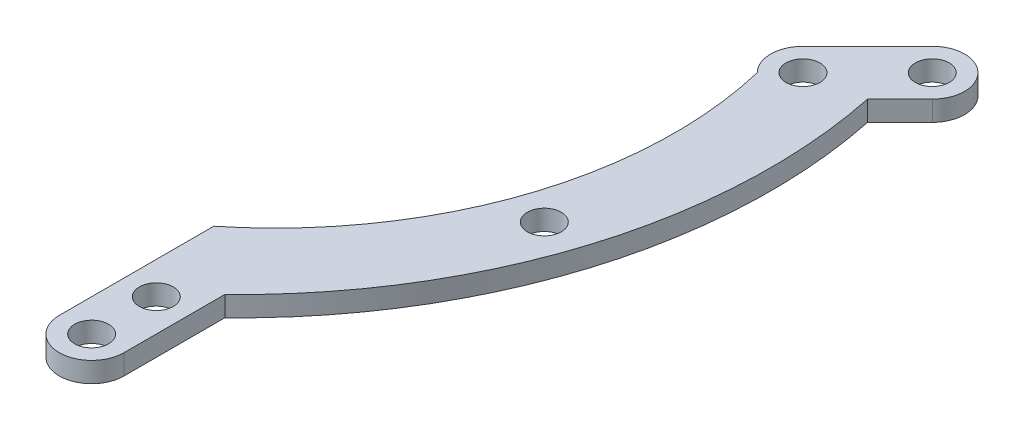
ISO-10303-21;
HEADER;
FILE_DESCRIPTION(('STEP AP214'),'2;1');
FILE_NAME('part.step','',(''),(''),'','','');
FILE_SCHEMA(('AUTOMOTIVE_DESIGN { 1 0 10303 214 1 1 1 1 }'));
ENDSEC;
DATA;
#1=APPLICATION_CONTEXT('core data for automotive mechanical design processes');
#2=APPLICATION_PROTOCOL_DEFINITION('international standard','automotive_design',2000,#1);
#3=PRODUCT_CONTEXT('',#1,'mechanical');
#4=PRODUCT('Part','Part','',(#3));
#5=PRODUCT_RELATED_PRODUCT_CATEGORY('part','',(#4));
#6=PRODUCT_DEFINITION_FORMATION('','',#4);
#7=PRODUCT_DEFINITION_CONTEXT('part definition',#1,'design');
#8=PRODUCT_DEFINITION('design','',#6,#7);
#9=PRODUCT_DEFINITION_SHAPE('','',#8);
#10=(LENGTH_UNIT() NAMED_UNIT(*) SI_UNIT(.MILLI.,.METRE.));
#11=(NAMED_UNIT(*) PLANE_ANGLE_UNIT() SI_UNIT($,.RADIAN.));
#12=(NAMED_UNIT(*) SI_UNIT($,.STERADIAN.) SOLID_ANGLE_UNIT());
#13=UNCERTAINTY_MEASURE_WITH_UNIT(LENGTH_MEASURE(1.E-05),#10,'distance_accuracy_value','');
#14=(GEOMETRIC_REPRESENTATION_CONTEXT(3) GLOBAL_UNCERTAINTY_ASSIGNED_CONTEXT((#13)) GLOBAL_UNIT_ASSIGNED_CONTEXT((#10,
#11,#12)) REPRESENTATION_CONTEXT('',''));
#15=CARTESIAN_POINT('',(0.,0.,0.));
#16=DIRECTION('',(0.,0.,1.));
#17=DIRECTION('',(1.,0.,0.));
#18=AXIS2_PLACEMENT_3D('',#15,#16,#17);
#19=CARTESIAN_POINT('',(-34.9552637204431,2.5,-17.7000790989439));
#20=DIRECTION('',(0.,1.,0.));
#21=DIRECTION('',(0.,0.,1.));
#22=AXIS2_PLACEMENT_3D('',#19,#20,#21);
#23=PLANE('',#22);
#24=CARTESIAN_POINT('',(16.,2.5,-32.));
#25=DIRECTION('',(0.,1.,0.));
#26=DIRECTION('',(0.,0.,1.));
#27=AXIS2_PLACEMENT_3D('',#24,#25,#26);
#28=CIRCLE('',#27,2.1);
#29=CARTESIAN_POINT('',(16.,2.5,-29.9));
#30=VERTEX_POINT('',#29);
#31=EDGE_CURVE('E210',#30,#30,#28,.T.);
#32=ORIENTED_EDGE('',*,*,#31,.F.);
#33=EDGE_LOOP('',(#32));
#34=FACE_BOUND('',#33,.T.);
#35=CARTESIAN_POINT('',(0.,2.5,32.));
#36=DIRECTION('',(0.,1.,0.));
#37=DIRECTION('',(0.,0.,1.));
#38=AXIS2_PLACEMENT_3D('',#35,#36,#37);
#39=CIRCLE('',#38,2.1);
#40=CARTESIAN_POINT('',(0.,2.5,34.1));
#41=VERTEX_POINT('',#40);
#42=EDGE_CURVE('E198',#41,#41,#39,.T.);
#43=ORIENTED_EDGE('',*,*,#42,.F.);
#44=EDGE_LOOP('',(#43));
#45=FACE_BOUND('',#44,.T.);
#46=CARTESIAN_POINT('',(-34.9552637204431,2.5,-17.7000790989439));
#47=DIRECTION('',(0.,-1.,0.));
#48=DIRECTION('',(0.,0.,1.));
#49=AXIS2_PLACEMENT_3D('',#46,#47,#48);
#50=CIRCLE('',#49,49.4751207190931);
#51=CARTESIAN_POINT('',(13.1715728752538,2.5,-29.1715728752538));
#52=VERTEX_POINT('',#51);
#53=CARTESIAN_POINT('',(-4.,2.5,20.8947290773723));
#54=VERTEX_POINT('',#53);
#55=EDGE_CURVE('E154',#52,#54,#50,.T.);
#56=ORIENTED_EDGE('',*,*,#55,.T.);
#57=DIRECTION('',(0.,0.,1.));
#58=VECTOR('',#57,1.);
#59=CARTESIAN_POINT('',(-4.,2.5,20.8947290773723));
#60=LINE('',#59,#58);
#61=CARTESIAN_POINT('',(-4.,2.5,40.));
#62=VERTEX_POINT('',#61);
#63=EDGE_CURVE('E96',#54,#62,#60,.T.);
#64=ORIENTED_EDGE('',*,*,#63,.T.);
#65=CARTESIAN_POINT('',(0.,2.5,40.));
#66=DIRECTION('',(0.,1.,0.));
#67=DIRECTION('',(0.,0.,1.));
#68=AXIS2_PLACEMENT_3D('',#65,#66,#67);
#69=CIRCLE('',#68,4.);
#70=CARTESIAN_POINT('',(4.,2.5,40.));
#71=VERTEX_POINT('',#70);
#72=EDGE_CURVE('E172',#62,#71,#69,.T.);
#73=ORIENTED_EDGE('',*,*,#72,.T.);
#74=DIRECTION('',(0.,0.,-1.));
#75=VECTOR('',#74,1.);
#76=CARTESIAN_POINT('',(4.,2.5,36.));
#77=LINE('',#76,#75);
#78=CARTESIAN_POINT('',(4.,2.5,27.5250815722734));
#79=VERTEX_POINT('',#78);
#80=EDGE_CURVE('E188',#71,#79,#77,.T.);
#81=ORIENTED_EDGE('',*,*,#80,.T.);
#82=CARTESIAN_POINT('',(-41.5780607116321,2.5,-19.8821435103053));
#83=DIRECTION('',(0.,1.,0.));
#84=DIRECTION('',(0.,0.,1.));
#85=AXIS2_PLACEMENT_3D('',#82,#83,#84);
#86=CIRCLE('',#85,65.7632466371871);
#87=CARTESIAN_POINT('',(22.8284271247462,2.5,-33.1715728752538));
#88=VERTEX_POINT('',#87);
#89=EDGE_CURVE('E187',#79,#88,#86,.T.);
#90=ORIENTED_EDGE('',*,*,#89,.T.);
#91=DIRECTION('',(0.707106781186547,0.,-0.707106781186548));
#92=VECTOR('',#91,1.);
#93=CARTESIAN_POINT('',(22.8284271247462,2.5,-33.1715728752538));
#94=LINE('',#93,#92);
#95=CARTESIAN_POINT('',(26.8284271247462,2.5,-37.1715728752538));
#96=VERTEX_POINT('',#95);
#97=EDGE_CURVE('E118',#88,#96,#94,.T.);
#98=ORIENTED_EDGE('',*,*,#97,.T.);
#99=CARTESIAN_POINT('',(24.,2.5,-40.));
#100=DIRECTION('',(0.,1.,0.));
#101=DIRECTION('',(0.,0.,1.));
#102=AXIS2_PLACEMENT_3D('',#99,#100,#101);
#103=CIRCLE('',#102,4.);
#104=CARTESIAN_POINT('',(21.1715728752538,2.5,-42.8284271247462));
#105=VERTEX_POINT('',#104);
#106=EDGE_CURVE('E112',#96,#105,#103,.T.);
#107=ORIENTED_EDGE('',*,*,#106,.T.);
#108=DIRECTION('',(-0.707106781186547,0.,0.707106781186548));
#109=VECTOR('',#108,1.);
#110=CARTESIAN_POINT('',(13.1715728752538,2.5,-34.8284271247462));
#111=LINE('',#110,#109);
#112=CARTESIAN_POINT('',(13.1715728752538,2.5,-34.8284271247462));
#113=VERTEX_POINT('',#112);
#114=EDGE_CURVE('E116',#105,#113,#111,.T.);
#115=ORIENTED_EDGE('',*,*,#114,.T.);
#116=CARTESIAN_POINT('',(16.,2.5,-32.));
#117=DIRECTION('',(0.,1.,0.));
#118=DIRECTION('',(0.,0.,1.));
#119=AXIS2_PLACEMENT_3D('',#116,#117,#118);
#120=CIRCLE('',#119,4.);
#121=EDGE_CURVE('E50',#113,#52,#120,.T.);
#122=ORIENTED_EDGE('',*,*,#121,.T.);
#123=EDGE_LOOP('',(#56,#64,#73,#81,#90,#98,#107,#115,#122));
#124=FACE_BOUND('',#123,.T.);
#125=CARTESIAN_POINT('',(16.,2.5,0.));
#126=DIRECTION('',(0.,1.,0.));
#127=DIRECTION('',(0.,0.,1.));
#128=AXIS2_PLACEMENT_3D('',#125,#126,#127);
#129=CIRCLE('',#128,2.1);
#130=CARTESIAN_POINT('',(16.,2.5,2.1));
#131=VERTEX_POINT('',#130);
#132=EDGE_CURVE('E140',#131,#131,#129,.T.);
#133=ORIENTED_EDGE('',*,*,#132,.F.);
#134=EDGE_LOOP('',(#133));
#135=FACE_BOUND('',#134,.T.);
#136=CARTESIAN_POINT('',(0.,2.5,40.));
#137=DIRECTION('',(0.,1.,0.));
#138=DIRECTION('',(0.,0.,1.));
#139=AXIS2_PLACEMENT_3D('',#136,#137,#138);
#140=CIRCLE('',#139,2.1);
#141=CARTESIAN_POINT('',(0.,2.5,42.1));
#142=VERTEX_POINT('',#141);
#143=EDGE_CURVE('E204',#142,#142,#140,.T.);
#144=ORIENTED_EDGE('',*,*,#143,.F.);
#145=EDGE_LOOP('',(#144));
#146=FACE_BOUND('',#145,.T.);
#147=CARTESIAN_POINT('',(24.,2.5,-40.));
#148=DIRECTION('',(0.,1.,0.));
#149=DIRECTION('',(0.,0.,1.));
#150=AXIS2_PLACEMENT_3D('',#147,#148,#149);
#151=CIRCLE('',#150,2.1);
#152=CARTESIAN_POINT('',(24.,2.5,-37.9));
#153=VERTEX_POINT('',#152);
#154=EDGE_CURVE('E216',#153,#153,#151,.T.);
#155=ORIENTED_EDGE('',*,*,#154,.F.);
#156=EDGE_LOOP('',(#155));
#157=FACE_BOUND('',#156,.T.);
#158=ADVANCED_FACE('F33',(#34,#45,#124,#135,#146,#157),#23,.T.);
#159=CARTESIAN_POINT('',(-34.9552637204431,0.,-17.7000790989439));
#160=DIRECTION('',(0.,1.,0.));
#161=DIRECTION('',(0.,0.,1.));
#162=AXIS2_PLACEMENT_3D('',#159,#160,#161);
#163=PLANE('',#162);
#164=CARTESIAN_POINT('',(-34.9552637204431,0.,-17.7000790989439));
#165=DIRECTION('',(0.,-1.,0.));
#166=DIRECTION('',(0.,0.,1.));
#167=AXIS2_PLACEMENT_3D('',#164,#165,#166);
#168=CIRCLE('',#167,49.4751207190931);
#169=CARTESIAN_POINT('',(13.1715728752538,0.,-29.1715728752538));
#170=VERTEX_POINT('',#169);
#171=CARTESIAN_POINT('',(-4.,0.,20.8947290773723));
#172=VERTEX_POINT('',#171);
#173=EDGE_CURVE('E136',#170,#172,#168,.T.);
#174=ORIENTED_EDGE('',*,*,#173,.F.);
#175=CARTESIAN_POINT('',(16.,0.,-32.));
#176=DIRECTION('',(0.,1.,0.));
#177=DIRECTION('',(0.,0.,1.));
#178=AXIS2_PLACEMENT_3D('',#175,#176,#177);
#179=CIRCLE('',#178,4.);
#180=CARTESIAN_POINT('',(13.1715728752538,0.,-34.8284271247462));
#181=VERTEX_POINT('',#180);
#182=EDGE_CURVE('E88',#181,#170,#179,.T.);
#183=ORIENTED_EDGE('',*,*,#182,.F.);
#184=DIRECTION('',(-0.707106781186547,0.,0.707106781186548));
#185=VECTOR('',#184,1.);
#186=CARTESIAN_POINT('',(13.1715728752538,0.,-34.8284271247462));
#187=LINE('',#186,#185);
#188=CARTESIAN_POINT('',(21.1715728752538,0.,-42.8284271247462));
#189=VERTEX_POINT('',#188);
#190=EDGE_CURVE('E82',#189,#181,#187,.T.);
#191=ORIENTED_EDGE('',*,*,#190,.F.);
#192=CARTESIAN_POINT('',(24.,0.,-40.));
#193=DIRECTION('',(0.,1.,0.));
#194=DIRECTION('',(0.,0.,1.));
#195=AXIS2_PLACEMENT_3D('',#192,#193,#194);
#196=CIRCLE('',#195,4.);
#197=CARTESIAN_POINT('',(26.8284271247462,0.,-37.1715728752538));
#198=VERTEX_POINT('',#197);
#199=EDGE_CURVE('E126',#198,#189,#196,.T.);
#200=ORIENTED_EDGE('',*,*,#199,.F.);
#201=DIRECTION('',(0.707106781186547,0.,-0.707106781186548));
#202=VECTOR('',#201,1.);
#203=CARTESIAN_POINT('',(22.8284271247462,0.,-33.1715728752538));
#204=LINE('',#203,#202);
#205=CARTESIAN_POINT('',(22.8284271247462,0.,-33.1715728752538));
#206=VERTEX_POINT('',#205);
#207=EDGE_CURVE('E149',#206,#198,#204,.T.);
#208=ORIENTED_EDGE('',*,*,#207,.F.);
#209=CARTESIAN_POINT('',(-41.5780607116321,0.,-19.8821435103053));
#210=DIRECTION('',(0.,1.,0.));
#211=DIRECTION('',(0.,0.,1.));
#212=AXIS2_PLACEMENT_3D('',#209,#210,#211);
#213=CIRCLE('',#212,65.7632466371871);
#214=CARTESIAN_POINT('',(4.,0.,27.5250815722734));
#215=VERTEX_POINT('',#214);
#216=EDGE_CURVE('E147',#215,#206,#213,.T.);
#217=ORIENTED_EDGE('',*,*,#216,.F.);
#218=DIRECTION('',(0.,0.,-1.));
#219=VECTOR('',#218,1.);
#220=CARTESIAN_POINT('',(4.,0.,27.5250815722734));
#221=LINE('',#220,#219);
#222=CARTESIAN_POINT('',(4.,0.,40.));
#223=VERTEX_POINT('',#222);
#224=EDGE_CURVE('E145',#223,#215,#221,.T.);
#225=ORIENTED_EDGE('',*,*,#224,.F.);
#226=CARTESIAN_POINT('',(0.,0.,40.));
#227=DIRECTION('',(0.,1.,0.));
#228=DIRECTION('',(0.,0.,1.));
#229=AXIS2_PLACEMENT_3D('',#226,#227,#228);
#230=CIRCLE('',#229,4.);
#231=CARTESIAN_POINT('',(-4.,0.,40.));
#232=VERTEX_POINT('',#231);
#233=EDGE_CURVE('E142',#232,#223,#230,.T.);
#234=ORIENTED_EDGE('',*,*,#233,.F.);
#235=DIRECTION('',(0.,0.,1.));
#236=VECTOR('',#235,1.);
#237=CARTESIAN_POINT('',(-4.,0.,32.));
#238=LINE('',#237,#236);
#239=EDGE_CURVE('E139',#172,#232,#238,.T.);
#240=ORIENTED_EDGE('',*,*,#239,.F.);
#241=EDGE_LOOP('',(#174,#183,#191,#200,#208,#217,#225,#234,#240));
#242=FACE_BOUND('',#241,.T.);
#243=CARTESIAN_POINT('',(16.,0.,0.));
#244=DIRECTION('',(0.,1.,0.));
#245=DIRECTION('',(0.,0.,1.));
#246=AXIS2_PLACEMENT_3D('',#243,#244,#245);
#247=CIRCLE('',#246,2.1);
#248=CARTESIAN_POINT('',(16.,0.,2.1));
#249=VERTEX_POINT('',#248);
#250=EDGE_CURVE('E195',#249,#249,#247,.T.);
#251=ORIENTED_EDGE('',*,*,#250,.T.);
#252=EDGE_LOOP('',(#251));
#253=FACE_BOUND('',#252,.T.);
#254=CARTESIAN_POINT('',(0.,0.,32.));
#255=DIRECTION('',(0.,1.,0.));
#256=DIRECTION('',(0.,0.,1.));
#257=AXIS2_PLACEMENT_3D('',#254,#255,#256);
#258=CIRCLE('',#257,2.1);
#259=CARTESIAN_POINT('',(0.,0.,34.1));
#260=VERTEX_POINT('',#259);
#261=EDGE_CURVE('E201',#260,#260,#258,.T.);
#262=ORIENTED_EDGE('',*,*,#261,.T.);
#263=EDGE_LOOP('',(#262));
#264=FACE_BOUND('',#263,.T.);
#265=CARTESIAN_POINT('',(0.,0.,40.));
#266=DIRECTION('',(0.,1.,0.));
#267=DIRECTION('',(0.,0.,1.));
#268=AXIS2_PLACEMENT_3D('',#265,#266,#267);
#269=CIRCLE('',#268,2.1);
#270=CARTESIAN_POINT('',(0.,0.,42.1));
#271=VERTEX_POINT('',#270);
#272=EDGE_CURVE('E207',#271,#271,#269,.T.);
#273=ORIENTED_EDGE('',*,*,#272,.T.);
#274=EDGE_LOOP('',(#273));
#275=FACE_BOUND('',#274,.T.);
#276=CARTESIAN_POINT('',(16.,0.,-32.));
#277=DIRECTION('',(0.,1.,0.));
#278=DIRECTION('',(0.,0.,1.));
#279=AXIS2_PLACEMENT_3D('',#276,#277,#278);
#280=CIRCLE('',#279,2.1);
#281=CARTESIAN_POINT('',(16.,0.,-29.9));
#282=VERTEX_POINT('',#281);
#283=EDGE_CURVE('E213',#282,#282,#280,.T.);
#284=ORIENTED_EDGE('',*,*,#283,.T.);
#285=EDGE_LOOP('',(#284));
#286=FACE_BOUND('',#285,.T.);
#287=CARTESIAN_POINT('',(24.,0.,-40.));
#288=DIRECTION('',(0.,1.,0.));
#289=DIRECTION('',(0.,0.,1.));
#290=AXIS2_PLACEMENT_3D('',#287,#288,#289);
#291=CIRCLE('',#290,2.1);
#292=CARTESIAN_POINT('',(24.,0.,-37.9));
#293=VERTEX_POINT('',#292);
#294=EDGE_CURVE('E219',#293,#293,#291,.T.);
#295=ORIENTED_EDGE('',*,*,#294,.T.);
#296=EDGE_LOOP('',(#295));
#297=FACE_BOUND('',#296,.T.);
#298=ADVANCED_FACE('F175',(#242,#253,#264,#275,#286,#297),#163,.F.);
#299=CARTESIAN_POINT('',(-34.9552637204431,2.5,-17.7000790989439));
#300=DIRECTION('',(0.,-1.,0.));
#301=DIRECTION('',(0.,0.,-1.));
#302=AXIS2_PLACEMENT_3D('',#299,#300,#301);
#303=CYLINDRICAL_SURFACE('',#302,49.4751207190931);
#304=ORIENTED_EDGE('',*,*,#173,.T.);
#305=DIRECTION('',(0.,-1.,0.));
#306=VECTOR('',#305,1.);
#307=CARTESIAN_POINT('',(-4.,2.5,20.8947290773723));
#308=LINE('',#307,#306);
#309=EDGE_CURVE('E11',#54,#172,#308,.T.);
#310=ORIENTED_EDGE('',*,*,#309,.F.);
#311=ORIENTED_EDGE('',*,*,#55,.F.);
#312=DIRECTION('',(0.,-1.,0.));
#313=VECTOR('',#312,1.);
#314=CARTESIAN_POINT('',(13.1715728752538,2.5,-29.1715728752538));
#315=LINE('',#314,#313);
#316=EDGE_CURVE('E132',#52,#170,#315,.T.);
#317=ORIENTED_EDGE('',*,*,#316,.T.);
#318=EDGE_LOOP('',(#304,#310,#311,#317));
#319=FACE_BOUND('',#318,.T.);
#320=ADVANCED_FACE('F35',(#319),#303,.F.);
#321=CARTESIAN_POINT('',(-4.,2.5,32.));
#322=DIRECTION('',(1.,0.,0.));
#323=DIRECTION('',(0.,0.,-1.));
#324=AXIS2_PLACEMENT_3D('',#321,#322,#323);
#325=PLANE('',#324);
#326=ORIENTED_EDGE('',*,*,#239,.T.);
#327=DIRECTION('',(0.,-1.,0.));
#328=VECTOR('',#327,1.);
#329=CARTESIAN_POINT('',(-4.,2.5,40.));
#330=LINE('',#329,#328);
#331=EDGE_CURVE('E42',#62,#232,#330,.T.);
#332=ORIENTED_EDGE('',*,*,#331,.F.);
#333=ORIENTED_EDGE('',*,*,#63,.F.);
#334=ORIENTED_EDGE('',*,*,#309,.T.);
#335=EDGE_LOOP('',(#326,#332,#333,#334));
#336=FACE_BOUND('',#335,.T.);
#337=ADVANCED_FACE('F257',(#336),#325,.F.);
#338=CARTESIAN_POINT('',(0.,2.5,40.));
#339=DIRECTION('',(0.,-1.,0.));
#340=DIRECTION('',(0.,0.,-1.));
#341=AXIS2_PLACEMENT_3D('',#338,#339,#340);
#342=CYLINDRICAL_SURFACE('',#341,4.);
#343=ORIENTED_EDGE('',*,*,#233,.T.);
#344=DIRECTION('',(0.,-1.,0.));
#345=VECTOR('',#344,1.);
#346=CARTESIAN_POINT('',(4.,2.5,40.));
#347=LINE('',#346,#345);
#348=EDGE_CURVE('E164',#71,#223,#347,.T.);
#349=ORIENTED_EDGE('',*,*,#348,.F.);
#350=ORIENTED_EDGE('',*,*,#72,.F.);
#351=ORIENTED_EDGE('',*,*,#331,.T.);
#352=EDGE_LOOP('',(#343,#349,#350,#351));
#353=FACE_BOUND('',#352,.T.);
#354=ADVANCED_FACE('F170',(#353),#342,.T.);
#355=CARTESIAN_POINT('',(4.,2.5,27.5250815722734));
#356=DIRECTION('',(-1.,0.,0.));
#357=DIRECTION('',(0.,0.,1.));
#358=AXIS2_PLACEMENT_3D('',#355,#356,#357);
#359=PLANE('',#358);
#360=ORIENTED_EDGE('',*,*,#224,.T.);
#361=DIRECTION('',(0.,-1.,0.));
#362=VECTOR('',#361,1.);
#363=CARTESIAN_POINT('',(4.,2.5,27.5250815722734));
#364=LINE('',#363,#362);
#365=EDGE_CURVE('E161',#79,#215,#364,.T.);
#366=ORIENTED_EDGE('',*,*,#365,.F.);
#367=ORIENTED_EDGE('',*,*,#80,.F.);
#368=ORIENTED_EDGE('',*,*,#348,.T.);
#369=EDGE_LOOP('',(#360,#366,#367,#368));
#370=FACE_BOUND('',#369,.T.);
#371=ADVANCED_FACE('F181',(#370),#359,.F.);
#372=CARTESIAN_POINT('',(-41.5780607116321,2.5,-19.8821435103053));
#373=DIRECTION('',(0.,-1.,0.));
#374=DIRECTION('',(0.,0.,-1.));
#375=AXIS2_PLACEMENT_3D('',#372,#373,#374);
#376=CYLINDRICAL_SURFACE('',#375,65.7632466371871);
#377=ORIENTED_EDGE('',*,*,#216,.T.);
#378=DIRECTION('',(0.,-1.,0.));
#379=VECTOR('',#378,1.);
#380=CARTESIAN_POINT('',(22.8284271247462,2.5,-33.1715728752538));
#381=LINE('',#380,#379);
#382=EDGE_CURVE('E158',#88,#206,#381,.T.);
#383=ORIENTED_EDGE('',*,*,#382,.F.);
#384=ORIENTED_EDGE('',*,*,#89,.F.);
#385=ORIENTED_EDGE('',*,*,#365,.T.);
#386=EDGE_LOOP('',(#377,#383,#384,#385));
#387=FACE_BOUND('',#386,.T.);
#388=ADVANCED_FACE('F185',(#387),#376,.T.);
#389=CARTESIAN_POINT('',(22.8284271247462,2.5,-33.1715728752538));
#390=DIRECTION('',(-0.707106781186548,0.,-0.707106781186547));
#391=DIRECTION('',(-0.707106781186547,0.,0.707106781186548));
#392=AXIS2_PLACEMENT_3D('',#389,#390,#391);
#393=PLANE('',#392);
#394=ORIENTED_EDGE('',*,*,#207,.T.);
#395=DIRECTION('',(0.,-1.,0.));
#396=VECTOR('',#395,1.);
#397=CARTESIAN_POINT('',(26.8284271247462,2.5,-37.1715728752538));
#398=LINE('',#397,#396);
#399=EDGE_CURVE('E127',#96,#198,#398,.T.);
#400=ORIENTED_EDGE('',*,*,#399,.F.);
#401=ORIENTED_EDGE('',*,*,#97,.F.);
#402=ORIENTED_EDGE('',*,*,#382,.T.);
#403=EDGE_LOOP('',(#394,#400,#401,#402));
#404=FACE_BOUND('',#403,.T.);
#405=ADVANCED_FACE('F248',(#404),#393,.F.);
#406=CARTESIAN_POINT('',(24.,2.5,-40.));
#407=DIRECTION('',(0.,-1.,0.));
#408=DIRECTION('',(0.,0.,-1.));
#409=AXIS2_PLACEMENT_3D('',#406,#407,#408);
#410=CYLINDRICAL_SURFACE('',#409,4.);
#411=ORIENTED_EDGE('',*,*,#199,.T.);
#412=DIRECTION('',(0.,-1.,0.));
#413=VECTOR('',#412,1.);
#414=CARTESIAN_POINT('',(21.1715728752538,2.5,-42.8284271247462));
#415=LINE('',#414,#413);
#416=EDGE_CURVE('E123',#105,#189,#415,.T.);
#417=ORIENTED_EDGE('',*,*,#416,.F.);
#418=ORIENTED_EDGE('',*,*,#106,.F.);
#419=ORIENTED_EDGE('',*,*,#399,.T.);
#420=EDGE_LOOP('',(#411,#417,#418,#419));
#421=FACE_BOUND('',#420,.T.);
#422=ADVANCED_FACE('F124',(#421),#410,.T.);
#423=CARTESIAN_POINT('',(13.1715728752538,2.5,-34.8284271247462));
#424=DIRECTION('',(0.707106781186548,0.,0.707106781186547));
#425=DIRECTION('',(0.707106781186547,0.,-0.707106781186548));
#426=AXIS2_PLACEMENT_3D('',#423,#424,#425);
#427=PLANE('',#426);
#428=ORIENTED_EDGE('',*,*,#190,.T.);
#429=DIRECTION('',(0.,-1.,0.));
#430=VECTOR('',#429,1.);
#431=CARTESIAN_POINT('',(13.1715728752538,2.5,-34.8284271247462));
#432=LINE('',#431,#430);
#433=EDGE_CURVE('E128',#113,#181,#432,.T.);
#434=ORIENTED_EDGE('',*,*,#433,.F.);
#435=ORIENTED_EDGE('',*,*,#114,.F.);
#436=ORIENTED_EDGE('',*,*,#416,.T.);
#437=EDGE_LOOP('',(#428,#434,#435,#436));
#438=FACE_BOUND('',#437,.T.);
#439=ADVANCED_FACE('F130',(#438),#427,.F.);
#440=CARTESIAN_POINT('',(16.,2.5,-32.));
#441=DIRECTION('',(0.,-1.,0.));
#442=DIRECTION('',(0.,0.,-1.));
#443=AXIS2_PLACEMENT_3D('',#440,#441,#442);
#444=CYLINDRICAL_SURFACE('',#443,4.);
#445=ORIENTED_EDGE('',*,*,#182,.T.);
#446=ORIENTED_EDGE('',*,*,#316,.F.);
#447=ORIENTED_EDGE('',*,*,#121,.F.);
#448=ORIENTED_EDGE('',*,*,#433,.T.);
#449=EDGE_LOOP('',(#445,#446,#447,#448));
#450=FACE_BOUND('',#449,.T.);
#451=ADVANCED_FACE('F241',(#450),#444,.T.);
#452=CARTESIAN_POINT('',(16.,2.5,0.));
#453=DIRECTION('',(0.,-1.,0.));
#454=DIRECTION('',(0.,0.,-1.));
#455=AXIS2_PLACEMENT_3D('',#452,#453,#454);
#456=CYLINDRICAL_SURFACE('',#455,2.1);
#457=ORIENTED_EDGE('',*,*,#132,.T.);
#458=EDGE_LOOP('',(#457));
#459=FACE_BOUND('',#458,.T.);
#460=ORIENTED_EDGE('',*,*,#250,.F.);
#461=EDGE_LOOP('',(#460));
#462=FACE_BOUND('',#461,.T.);
#463=ADVANCED_FACE('F238',(#459,#462),#456,.F.);
#464=CARTESIAN_POINT('',(0.,2.5,32.));
#465=DIRECTION('',(0.,-1.,0.));
#466=DIRECTION('',(0.,0.,-1.));
#467=AXIS2_PLACEMENT_3D('',#464,#465,#466);
#468=CYLINDRICAL_SURFACE('',#467,2.1);
#469=ORIENTED_EDGE('',*,*,#42,.T.);
#470=EDGE_LOOP('',(#469));
#471=FACE_BOUND('',#470,.T.);
#472=ORIENTED_EDGE('',*,*,#261,.F.);
#473=EDGE_LOOP('',(#472));
#474=FACE_BOUND('',#473,.T.);
#475=ADVANCED_FACE('F332',(#471,#474),#468,.F.);
#476=CARTESIAN_POINT('',(0.,2.5,40.));
#477=DIRECTION('',(0.,-1.,0.));
#478=DIRECTION('',(0.,0.,-1.));
#479=AXIS2_PLACEMENT_3D('',#476,#477,#478);
#480=CYLINDRICAL_SURFACE('',#479,2.1);
#481=ORIENTED_EDGE('',*,*,#143,.T.);
#482=EDGE_LOOP('',(#481));
#483=FACE_BOUND('',#482,.T.);
#484=ORIENTED_EDGE('',*,*,#272,.F.);
#485=EDGE_LOOP('',(#484));
#486=FACE_BOUND('',#485,.T.);
#487=ADVANCED_FACE('F340',(#483,#486),#480,.F.);
#488=CARTESIAN_POINT('',(16.,2.5,-32.));
#489=DIRECTION('',(0.,-1.,0.));
#490=DIRECTION('',(0.,0.,-1.));
#491=AXIS2_PLACEMENT_3D('',#488,#489,#490);
#492=CYLINDRICAL_SURFACE('',#491,2.1);
#493=ORIENTED_EDGE('',*,*,#31,.T.);
#494=EDGE_LOOP('',(#493));
#495=FACE_BOUND('',#494,.T.);
#496=ORIENTED_EDGE('',*,*,#283,.F.);
#497=EDGE_LOOP('',(#496));
#498=FACE_BOUND('',#497,.T.);
#499=ADVANCED_FACE('F348',(#495,#498),#492,.F.);
#500=CARTESIAN_POINT('',(24.,2.5,-40.));
#501=DIRECTION('',(0.,-1.,0.));
#502=DIRECTION('',(0.,0.,-1.));
#503=AXIS2_PLACEMENT_3D('',#500,#501,#502);
#504=CYLINDRICAL_SURFACE('',#503,2.1);
#505=ORIENTED_EDGE('',*,*,#154,.T.);
#506=EDGE_LOOP('',(#505));
#507=FACE_BOUND('',#506,.T.);
#508=ORIENTED_EDGE('',*,*,#294,.F.);
#509=EDGE_LOOP('',(#508));
#510=FACE_BOUND('',#509,.T.);
#511=ADVANCED_FACE('F225',(#507,#510),#504,.F.);
#512=CLOSED_SHELL('',(#158,#298,#320,#337,#354,#371,#388,#405,#422,#439,#451,#463,#475,#487,
#499,#511));
#513=MANIFOLD_SOLID_BREP('B2',#512);
#514=ADVANCED_BREP_SHAPE_REPRESENTATION('',(#18,#513),#14);
#515=SHAPE_DEFINITION_REPRESENTATION(#9,#514);
ENDSEC;
END-ISO-10303-21;
